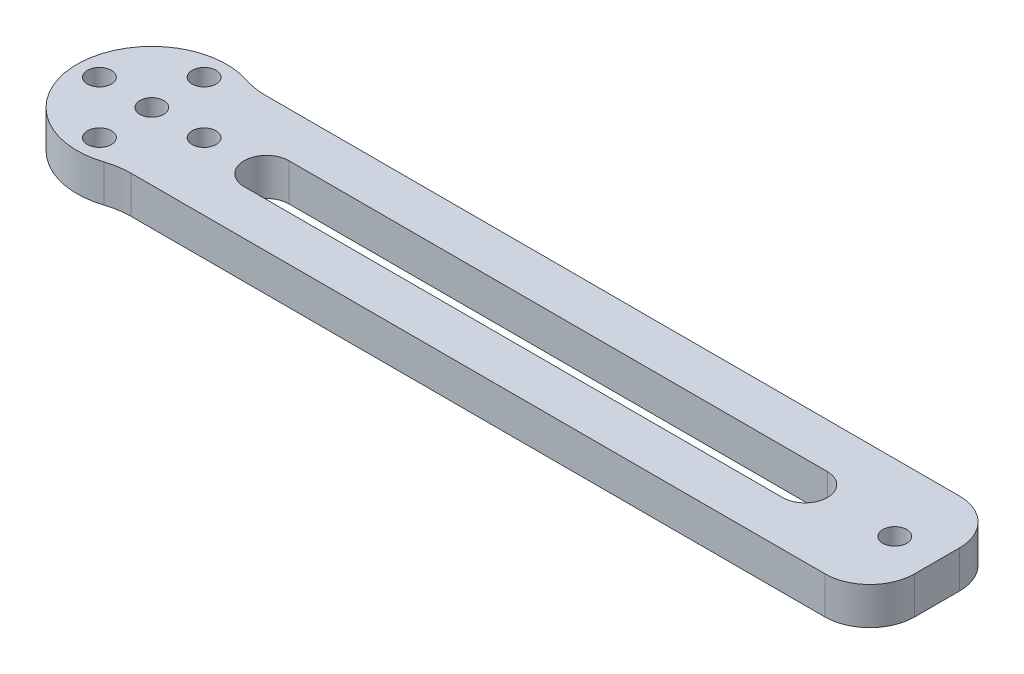
ISO-10303-21;
HEADER;
FILE_DESCRIPTION(('STEP AP214'),'2;1');
FILE_NAME('part.step','',(''),(''),'','','');
FILE_SCHEMA(('AUTOMOTIVE_DESIGN { 1 0 10303 214 1 1 1 1 }'));
ENDSEC;
DATA;
#1=APPLICATION_CONTEXT('core data for automotive mechanical design processes');
#2=APPLICATION_PROTOCOL_DEFINITION('international standard','automotive_design',2000,#1);
#3=PRODUCT_CONTEXT('',#1,'mechanical');
#4=PRODUCT('Part','Part','',(#3));
#5=PRODUCT_RELATED_PRODUCT_CATEGORY('part','',(#4));
#6=PRODUCT_DEFINITION_FORMATION('','',#4);
#7=PRODUCT_DEFINITION_CONTEXT('part definition',#1,'design');
#8=PRODUCT_DEFINITION('design','',#6,#7);
#9=PRODUCT_DEFINITION_SHAPE('','',#8);
#10=(LENGTH_UNIT() NAMED_UNIT(*) SI_UNIT(.MILLI.,.METRE.));
#11=(NAMED_UNIT(*) PLANE_ANGLE_UNIT() SI_UNIT($,.RADIAN.));
#12=(NAMED_UNIT(*) SI_UNIT($,.STERADIAN.) SOLID_ANGLE_UNIT());
#13=UNCERTAINTY_MEASURE_WITH_UNIT(LENGTH_MEASURE(1.E-05),#10,'distance_accuracy_value','');
#14=(GEOMETRIC_REPRESENTATION_CONTEXT(3) GLOBAL_UNCERTAINTY_ASSIGNED_CONTEXT((#13)) GLOBAL_UNIT_ASSIGNED_CONTEXT((#10,
#11,#12)) REPRESENTATION_CONTEXT('',''));
#15=CARTESIAN_POINT('',(0.,0.,0.));
#16=DIRECTION('',(0.,0.,1.));
#17=DIRECTION('',(1.,0.,0.));
#18=AXIS2_PLACEMENT_3D('',#15,#16,#17);
#19=CARTESIAN_POINT('',(99.34,5.,0.));
#20=DIRECTION('',(0.,-1.,0.));
#21=DIRECTION('',(0.,0.,-1.));
#22=AXIS2_PLACEMENT_3D('',#19,#20,#21);
#23=CYLINDRICAL_SURFACE('',#22,1.60000000000001);
#24=CARTESIAN_POINT('',(99.34,5.,0.));
#25=DIRECTION('',(0.,1.,0.));
#26=DIRECTION('',(0.,0.,1.));
#27=AXIS2_PLACEMENT_3D('',#24,#25,#26);
#28=CIRCLE('',#27,1.60000000000001);
#29=CARTESIAN_POINT('',(99.34,5.,1.59999999999999));
#30=VERTEX_POINT('',#29);
#31=EDGE_CURVE('E180',#30,#30,#28,.T.);
#32=ORIENTED_EDGE('',*,*,#31,.T.);
#33=EDGE_LOOP('',(#32));
#34=FACE_BOUND('',#33,.T.);
#35=CARTESIAN_POINT('',(99.34,2.5,0.));
#36=DIRECTION('',(0.,-1.,0.));
#37=DIRECTION('',(0.,0.,-1.));
#38=AXIS2_PLACEMENT_3D('',#35,#36,#37);
#39=CIRCLE('',#38,1.60000000000001);
#40=CARTESIAN_POINT('',(99.34,2.5,-1.60000000000002));
#41=VERTEX_POINT('',#40);
#42=EDGE_CURVE('E201',#41,#41,#39,.T.);
#43=ORIENTED_EDGE('',*,*,#42,.T.);
#44=EDGE_LOOP('',(#43));
#45=FACE_BOUND('',#44,.T.);
#46=ADVANCED_FACE('F47',(#34,#45),#23,.F.);
#47=CARTESIAN_POINT('',(99.,5.,-2.99999999999999));
#48=DIRECTION('',(0.,-1.,0.));
#49=DIRECTION('',(0.,0.,-1.));
#50=AXIS2_PLACEMENT_3D('',#47,#48,#49);
#51=CYLINDRICAL_SURFACE('',#50,6.00000000000001);
#52=CARTESIAN_POINT('',(99.,0.,-2.99999999999999));
#53=DIRECTION('',(0.,1.,0.));
#54=DIRECTION('',(0.,0.,1.));
#55=AXIS2_PLACEMENT_3D('',#52,#53,#54);
#56=CIRCLE('',#55,6.00000000000001);
#57=CARTESIAN_POINT('',(99.,0.,-8.99999999999999));
#58=VERTEX_POINT('',#57);
#59=CARTESIAN_POINT('',(105.,0.,-2.99999999999999));
#60=VERTEX_POINT('',#59);
#61=EDGE_CURVE('E209',#58,#60,#56,.F.);
#62=ORIENTED_EDGE('',*,*,#61,.F.);
#63=DIRECTION('',(0.,-1.,0.));
#64=VECTOR('',#63,1.);
#65=CARTESIAN_POINT('',(99.,5.,-8.99999999999999));
#66=LINE('',#65,#64);
#67=CARTESIAN_POINT('',(99.,5.,-8.99999999999999));
#68=VERTEX_POINT('',#67);
#69=EDGE_CURVE('E242',#68,#58,#66,.T.);
#70=ORIENTED_EDGE('',*,*,#69,.F.);
#71=CARTESIAN_POINT('',(99.,5.,-2.99999999999999));
#72=DIRECTION('',(0.,1.,0.));
#73=DIRECTION('',(0.,0.,1.));
#74=AXIS2_PLACEMENT_3D('',#71,#72,#73);
#75=CIRCLE('',#74,6.00000000000001);
#76=CARTESIAN_POINT('',(105.,5.,-2.99999999999999));
#77=VERTEX_POINT('',#76);
#78=EDGE_CURVE('E166',#68,#77,#75,.F.);
#79=ORIENTED_EDGE('',*,*,#78,.T.);
#80=DIRECTION('',(0.,-1.,0.));
#81=VECTOR('',#80,1.);
#82=CARTESIAN_POINT('',(105.,5.,-2.99999999999999));
#83=LINE('',#82,#81);
#84=EDGE_CURVE('E144',#77,#60,#83,.T.);
#85=ORIENTED_EDGE('',*,*,#84,.T.);
#86=EDGE_LOOP('',(#62,#70,#79,#85));
#87=FACE_BOUND('',#86,.T.);
#88=ADVANCED_FACE('F298',(#87),#51,.T.);
#89=CARTESIAN_POINT('',(0.,5.,-8.99999999999999));
#90=DIRECTION('',(0.,0.,-1.));
#91=DIRECTION('',(-1.,0.,0.));
#92=AXIS2_PLACEMENT_3D('',#89,#90,#91);
#93=PLANE('',#92);
#94=DIRECTION('',(1.,0.,0.));
#95=VECTOR('',#94,1.);
#96=CARTESIAN_POINT('',(0.,0.,-8.99999999999999));
#97=LINE('',#96,#95);
#98=CARTESIAN_POINT('',(6.24499799839843,0.,-8.99999999999999));
#99=VERTEX_POINT('',#98);
#100=EDGE_CURVE('E212',#99,#58,#97,.T.);
#101=ORIENTED_EDGE('',*,*,#100,.F.);
#102=DIRECTION('',(0.,-1.,0.));
#103=VECTOR('',#102,1.);
#104=CARTESIAN_POINT('',(6.24499799839843,5.,-8.99999999999999));
#105=LINE('',#104,#103);
#106=CARTESIAN_POINT('',(6.24499799839843,5.,-8.99999999999999));
#107=VERTEX_POINT('',#106);
#108=EDGE_CURVE('E68',#99,#107,#105,.F.);
#109=ORIENTED_EDGE('',*,*,#108,.T.);
#110=DIRECTION('',(1.,0.,0.));
#111=VECTOR('',#110,1.);
#112=CARTESIAN_POINT('',(0.,5.,-8.99999999999999));
#113=LINE('',#112,#111);
#114=EDGE_CURVE('E169',#107,#68,#113,.T.);
#115=ORIENTED_EDGE('',*,*,#114,.T.);
#116=ORIENTED_EDGE('',*,*,#69,.T.);
#117=EDGE_LOOP('',(#101,#109,#115,#116));
#118=FACE_BOUND('',#117,.T.);
#119=ADVANCED_FACE('F313',(#118),#93,.T.);
#120=CARTESIAN_POINT('',(0.,5.,8.99999999999999));
#121=DIRECTION('',(0.,0.,1.));
#122=DIRECTION('',(1.,0.,0.));
#123=AXIS2_PLACEMENT_3D('',#120,#121,#122);
#124=PLANE('',#123);
#125=DIRECTION('',(-1.,0.,0.));
#126=VECTOR('',#125,1.);
#127=CARTESIAN_POINT('',(0.,5.,8.99999999999999));
#128=LINE('',#127,#126);
#129=CARTESIAN_POINT('',(99.,5.,8.99999999999999));
#130=VERTEX_POINT('',#129);
#131=CARTESIAN_POINT('',(6.24499799839843,5.,8.99999999999999));
#132=VERTEX_POINT('',#131);
#133=EDGE_CURVE('E171',#130,#132,#128,.T.);
#134=ORIENTED_EDGE('',*,*,#133,.T.);
#135=DIRECTION('',(0.,-1.,0.));
#136=VECTOR('',#135,1.);
#137=CARTESIAN_POINT('',(6.24499799839843,0.,8.99999999999999));
#138=LINE('',#137,#136);
#139=CARTESIAN_POINT('',(6.24499799839843,0.,8.99999999999999));
#140=VERTEX_POINT('',#139);
#141=EDGE_CURVE('E258',#132,#140,#138,.T.);
#142=ORIENTED_EDGE('',*,*,#141,.T.);
#143=DIRECTION('',(-1.,0.,0.));
#144=VECTOR('',#143,1.);
#145=CARTESIAN_POINT('',(0.,0.,8.99999999999999));
#146=LINE('',#145,#144);
#147=CARTESIAN_POINT('',(99.,0.,8.99999999999999));
#148=VERTEX_POINT('',#147);
#149=EDGE_CURVE('E214',#148,#140,#146,.T.);
#150=ORIENTED_EDGE('',*,*,#149,.F.);
#151=DIRECTION('',(0.,-1.,0.));
#152=VECTOR('',#151,1.);
#153=CARTESIAN_POINT('',(99.,5.,8.99999999999999));
#154=LINE('',#153,#152);
#155=EDGE_CURVE('E240',#130,#148,#154,.T.);
#156=ORIENTED_EDGE('',*,*,#155,.F.);
#157=EDGE_LOOP('',(#134,#142,#150,#156));
#158=FACE_BOUND('',#157,.T.);
#159=ADVANCED_FACE('F286',(#158),#124,.T.);
#160=CARTESIAN_POINT('',(99.,5.,2.99999999999999));
#161=DIRECTION('',(0.,-1.,0.));
#162=DIRECTION('',(0.,0.,-1.));
#163=AXIS2_PLACEMENT_3D('',#160,#161,#162);
#164=CYLINDRICAL_SURFACE('',#163,6.00000000000001);
#165=CARTESIAN_POINT('',(99.,0.,2.99999999999999));
#166=DIRECTION('',(0.,1.,0.));
#167=DIRECTION('',(0.,0.,1.));
#168=AXIS2_PLACEMENT_3D('',#165,#166,#167);
#169=CIRCLE('',#168,6.00000000000001);
#170=CARTESIAN_POINT('',(105.,0.,2.99999999999999));
#171=VERTEX_POINT('',#170);
#172=EDGE_CURVE('E217',#171,#148,#169,.F.);
#173=ORIENTED_EDGE('',*,*,#172,.F.);
#174=DIRECTION('',(0.,-1.,0.));
#175=VECTOR('',#174,1.);
#176=CARTESIAN_POINT('',(105.,5.,2.99999999999999));
#177=LINE('',#176,#175);
#178=CARTESIAN_POINT('',(105.,5.,2.99999999999999));
#179=VERTEX_POINT('',#178);
#180=EDGE_CURVE('E238',#179,#171,#177,.T.);
#181=ORIENTED_EDGE('',*,*,#180,.F.);
#182=CARTESIAN_POINT('',(99.,5.,2.99999999999999));
#183=DIRECTION('',(0.,1.,0.));
#184=DIRECTION('',(0.,0.,1.));
#185=AXIS2_PLACEMENT_3D('',#182,#183,#184);
#186=CIRCLE('',#185,6.00000000000001);
#187=EDGE_CURVE('E174',#179,#130,#186,.F.);
#188=ORIENTED_EDGE('',*,*,#187,.T.);
#189=ORIENTED_EDGE('',*,*,#155,.T.);
#190=EDGE_LOOP('',(#173,#181,#188,#189));
#191=FACE_BOUND('',#190,.T.);
#192=ADVANCED_FACE('F289',(#191),#164,.T.);
#193=CARTESIAN_POINT('',(87.34,5.,0.));
#194=DIRECTION('',(0.,-1.,0.));
#195=DIRECTION('',(0.,0.,-1.));
#196=AXIS2_PLACEMENT_3D('',#193,#194,#195);
#197=CYLINDRICAL_SURFACE('',#196,3.);
#198=CARTESIAN_POINT('',(87.34,0.,0.));
#199=DIRECTION('',(0.,1.,0.));
#200=DIRECTION('',(0.,0.,1.));
#201=AXIS2_PLACEMENT_3D('',#198,#199,#200);
#202=CIRCLE('',#201,3.);
#203=CARTESIAN_POINT('',(87.34,0.,2.99999999999999));
#204=VERTEX_POINT('',#203);
#205=CARTESIAN_POINT('',(87.34,0.,-3.00000000000001));
#206=VERTEX_POINT('',#205);
#207=EDGE_CURVE('E139',#204,#206,#202,.T.);
#208=ORIENTED_EDGE('',*,*,#207,.F.);
#209=DIRECTION('',(0.,-1.,0.));
#210=VECTOR('',#209,1.);
#211=CARTESIAN_POINT('',(87.34,5.,2.99999999999999));
#212=LINE('',#211,#210);
#213=CARTESIAN_POINT('',(87.34,5.,2.99999999999999));
#214=VERTEX_POINT('',#213);
#215=EDGE_CURVE('E134',#214,#204,#212,.T.);
#216=ORIENTED_EDGE('',*,*,#215,.F.);
#217=CARTESIAN_POINT('',(87.34,5.,0.));
#218=DIRECTION('',(0.,1.,0.));
#219=DIRECTION('',(0.,0.,1.));
#220=AXIS2_PLACEMENT_3D('',#217,#218,#219);
#221=CIRCLE('',#220,3.);
#222=CARTESIAN_POINT('',(87.34,5.,-3.00000000000001));
#223=VERTEX_POINT('',#222);
#224=EDGE_CURVE('E137',#214,#223,#221,.T.);
#225=ORIENTED_EDGE('',*,*,#224,.T.);
#226=DIRECTION('',(0.,-1.,0.));
#227=VECTOR('',#226,1.);
#228=CARTESIAN_POINT('',(87.34,5.,-3.00000000000001));
#229=LINE('',#228,#227);
#230=EDGE_CURVE('E198',#223,#206,#229,.T.);
#231=ORIENTED_EDGE('',*,*,#230,.T.);
#232=EDGE_LOOP('',(#208,#216,#225,#231));
#233=FACE_BOUND('',#232,.T.);
#234=ADVANCED_FACE('F136',(#233),#197,.F.);
#235=CARTESIAN_POINT('',(0.,5.,3.));
#236=DIRECTION('',(0.,0.,-1.));
#237=DIRECTION('',(-1.,0.,0.));
#238=AXIS2_PLACEMENT_3D('',#235,#236,#237);
#239=PLANE('',#238);
#240=DIRECTION('',(1.,0.,0.));
#241=VECTOR('',#240,1.);
#242=CARTESIAN_POINT('',(0.,0.,3.));
#243=LINE('',#242,#241);
#244=CARTESIAN_POINT('',(15.34,0.,3.));
#245=VERTEX_POINT('',#244);
#246=EDGE_CURVE('E200',#245,#204,#243,.T.);
#247=ORIENTED_EDGE('',*,*,#246,.F.);
#248=DIRECTION('',(0.,-1.,0.));
#249=VECTOR('',#248,1.);
#250=CARTESIAN_POINT('',(15.34,5.,3.));
#251=LINE('',#250,#249);
#252=CARTESIAN_POINT('',(15.34,5.,3.));
#253=VERTEX_POINT('',#252);
#254=EDGE_CURVE('E145',#253,#245,#251,.T.);
#255=ORIENTED_EDGE('',*,*,#254,.F.);
#256=DIRECTION('',(1.,0.,0.));
#257=VECTOR('',#256,1.);
#258=CARTESIAN_POINT('',(0.,5.,3.));
#259=LINE('',#258,#257);
#260=EDGE_CURVE('E152',#253,#214,#259,.T.);
#261=ORIENTED_EDGE('',*,*,#260,.T.);
#262=ORIENTED_EDGE('',*,*,#215,.T.);
#263=EDGE_LOOP('',(#247,#255,#261,#262));
#264=FACE_BOUND('',#263,.T.);
#265=ADVANCED_FACE('F159',(#264),#239,.T.);
#266=CARTESIAN_POINT('',(15.34,5.,0.));
#267=DIRECTION('',(0.,-1.,0.));
#268=DIRECTION('',(0.,0.,-1.));
#269=AXIS2_PLACEMENT_3D('',#266,#267,#268);
#270=CYLINDRICAL_SURFACE('',#269,3.);
#271=CARTESIAN_POINT('',(15.34,0.,0.));
#272=DIRECTION('',(0.,1.,0.));
#273=DIRECTION('',(0.,0.,1.));
#274=AXIS2_PLACEMENT_3D('',#271,#272,#273);
#275=CIRCLE('',#274,3.);
#276=CARTESIAN_POINT('',(15.34,0.,-3.));
#277=VERTEX_POINT('',#276);
#278=EDGE_CURVE('E203',#277,#245,#275,.T.);
#279=ORIENTED_EDGE('',*,*,#278,.F.);
#280=DIRECTION('',(0.,-1.,0.));
#281=VECTOR('',#280,1.);
#282=CARTESIAN_POINT('',(15.34,5.,-3.));
#283=LINE('',#282,#281);
#284=CARTESIAN_POINT('',(15.34,5.,-3.));
#285=VERTEX_POINT('',#284);
#286=EDGE_CURVE('E247',#285,#277,#283,.T.);
#287=ORIENTED_EDGE('',*,*,#286,.F.);
#288=CARTESIAN_POINT('',(15.34,5.,0.));
#289=DIRECTION('',(0.,1.,0.));
#290=DIRECTION('',(0.,0.,1.));
#291=AXIS2_PLACEMENT_3D('',#288,#289,#290);
#292=CIRCLE('',#291,3.);
#293=EDGE_CURVE('E160',#285,#253,#292,.T.);
#294=ORIENTED_EDGE('',*,*,#293,.T.);
#295=ORIENTED_EDGE('',*,*,#254,.T.);
#296=EDGE_LOOP('',(#279,#287,#294,#295));
#297=FACE_BOUND('',#296,.T.);
#298=ADVANCED_FACE('F333',(#297),#270,.F.);
#299=CARTESIAN_POINT('',(-7.,5.,0.));
#300=DIRECTION('',(0.,-1.,0.));
#301=DIRECTION('',(0.,0.,-1.));
#302=AXIS2_PLACEMENT_3D('',#299,#300,#301);
#303=CYLINDRICAL_SURFACE('',#302,1.6);
#304=CARTESIAN_POINT('',(-7.,5.,0.));
#305=DIRECTION('',(0.,1.,0.));
#306=DIRECTION('',(0.,0.,1.));
#307=AXIS2_PLACEMENT_3D('',#304,#305,#306);
#308=CIRCLE('',#307,1.6);
#309=CARTESIAN_POINT('',(-7.,5.,1.6));
#310=VERTEX_POINT('',#309);
#311=EDGE_CURVE('E192',#310,#310,#308,.T.);
#312=ORIENTED_EDGE('',*,*,#311,.T.);
#313=EDGE_LOOP('',(#312));
#314=FACE_BOUND('',#313,.T.);
#315=CARTESIAN_POINT('',(-7.,0.,0.));
#316=DIRECTION('',(0.,1.,0.));
#317=DIRECTION('',(0.,0.,1.));
#318=AXIS2_PLACEMENT_3D('',#315,#316,#317);
#319=CIRCLE('',#318,1.6);
#320=CARTESIAN_POINT('',(-7.,0.,1.6));
#321=VERTEX_POINT('',#320);
#322=EDGE_CURVE('E232',#321,#321,#319,.T.);
#323=ORIENTED_EDGE('',*,*,#322,.F.);
#324=EDGE_LOOP('',(#323));
#325=FACE_BOUND('',#324,.T.);
#326=ADVANCED_FACE('F336',(#314,#325),#303,.F.);
#327=CARTESIAN_POINT('',(0.,5.,-7.));
#328=DIRECTION('',(0.,-1.,0.));
#329=DIRECTION('',(0.,0.,-1.));
#330=AXIS2_PLACEMENT_3D('',#327,#328,#329);
#331=CYLINDRICAL_SURFACE('',#330,1.6);
#332=CARTESIAN_POINT('',(0.,5.,-7.));
#333=DIRECTION('',(0.,1.,0.));
#334=DIRECTION('',(0.,0.,1.));
#335=AXIS2_PLACEMENT_3D('',#332,#333,#334);
#336=CIRCLE('',#335,1.6);
#337=CARTESIAN_POINT('',(0.,5.,-5.4));
#338=VERTEX_POINT('',#337);
#339=EDGE_CURVE('E189',#338,#338,#336,.T.);
#340=ORIENTED_EDGE('',*,*,#339,.T.);
#341=EDGE_LOOP('',(#340));
#342=FACE_BOUND('',#341,.T.);
#343=CARTESIAN_POINT('',(0.,0.,-7.));
#344=DIRECTION('',(0.,1.,0.));
#345=DIRECTION('',(0.,0.,1.));
#346=AXIS2_PLACEMENT_3D('',#343,#344,#345);
#347=CIRCLE('',#346,1.6);
#348=CARTESIAN_POINT('',(0.,0.,-5.4));
#349=VERTEX_POINT('',#348);
#350=EDGE_CURVE('E229',#349,#349,#347,.T.);
#351=ORIENTED_EDGE('',*,*,#350,.F.);
#352=EDGE_LOOP('',(#351));
#353=FACE_BOUND('',#352,.T.);
#354=ADVANCED_FACE('F362',(#342,#353),#331,.F.);
#355=CARTESIAN_POINT('',(7.,5.,0.));
#356=DIRECTION('',(0.,-1.,0.));
#357=DIRECTION('',(0.,0.,-1.));
#358=AXIS2_PLACEMENT_3D('',#355,#356,#357);
#359=CYLINDRICAL_SURFACE('',#358,1.6);
#360=CARTESIAN_POINT('',(7.,5.,0.));
#361=DIRECTION('',(0.,1.,0.));
#362=DIRECTION('',(0.,0.,1.));
#363=AXIS2_PLACEMENT_3D('',#360,#361,#362);
#364=CIRCLE('',#363,1.6);
#365=CARTESIAN_POINT('',(7.,5.,1.6));
#366=VERTEX_POINT('',#365);
#367=EDGE_CURVE('E186',#366,#366,#364,.T.);
#368=ORIENTED_EDGE('',*,*,#367,.T.);
#369=EDGE_LOOP('',(#368));
#370=FACE_BOUND('',#369,.T.);
#371=CARTESIAN_POINT('',(7.,0.,0.));
#372=DIRECTION('',(0.,1.,0.));
#373=DIRECTION('',(0.,0.,1.));
#374=AXIS2_PLACEMENT_3D('',#371,#372,#373);
#375=CIRCLE('',#374,1.6);
#376=CARTESIAN_POINT('',(7.,0.,1.6));
#377=VERTEX_POINT('',#376);
#378=EDGE_CURVE('E226',#377,#377,#375,.T.);
#379=ORIENTED_EDGE('',*,*,#378,.F.);
#380=EDGE_LOOP('',(#379));
#381=FACE_BOUND('',#380,.T.);
#382=ADVANCED_FACE('F371',(#370,#381),#359,.F.);
#383=CARTESIAN_POINT('',(0.,5.,7.));
#384=DIRECTION('',(0.,-1.,0.));
#385=DIRECTION('',(0.,0.,-1.));
#386=AXIS2_PLACEMENT_3D('',#383,#384,#385);
#387=CYLINDRICAL_SURFACE('',#386,1.6);
#388=CARTESIAN_POINT('',(0.,5.,7.));
#389=DIRECTION('',(0.,1.,0.));
#390=DIRECTION('',(0.,0.,1.));
#391=AXIS2_PLACEMENT_3D('',#388,#389,#390);
#392=CIRCLE('',#391,1.6);
#393=CARTESIAN_POINT('',(0.,5.,8.6));
#394=VERTEX_POINT('',#393);
#395=EDGE_CURVE('E183',#394,#394,#392,.T.);
#396=ORIENTED_EDGE('',*,*,#395,.T.);
#397=EDGE_LOOP('',(#396));
#398=FACE_BOUND('',#397,.T.);
#399=CARTESIAN_POINT('',(0.,0.,7.));
#400=DIRECTION('',(0.,1.,0.));
#401=DIRECTION('',(0.,0.,1.));
#402=AXIS2_PLACEMENT_3D('',#399,#400,#401);
#403=CIRCLE('',#402,1.6);
#404=CARTESIAN_POINT('',(0.,0.,8.6));
#405=VERTEX_POINT('',#404);
#406=EDGE_CURVE('E223',#405,#405,#403,.T.);
#407=ORIENTED_EDGE('',*,*,#406,.F.);
#408=EDGE_LOOP('',(#407));
#409=FACE_BOUND('',#408,.T.);
#410=ADVANCED_FACE('F318',(#398,#409),#387,.F.);
#411=CARTESIAN_POINT('',(105.,5.,0.));
#412=DIRECTION('',(1.,0.,0.));
#413=DIRECTION('',(0.,0.,-1.));
#414=AXIS2_PLACEMENT_3D('',#411,#412,#413);
#415=PLANE('',#414);
#416=DIRECTION('',(0.,0.,1.));
#417=VECTOR('',#416,1.);
#418=CARTESIAN_POINT('',(105.,0.,0.));
#419=LINE('',#418,#417);
#420=EDGE_CURVE('E220',#60,#171,#419,.T.);
#421=ORIENTED_EDGE('',*,*,#420,.F.);
#422=ORIENTED_EDGE('',*,*,#84,.F.);
#423=DIRECTION('',(0.,0.,1.));
#424=VECTOR('',#423,1.);
#425=CARTESIAN_POINT('',(105.,5.,0.));
#426=LINE('',#425,#424);
#427=EDGE_CURVE('E177',#77,#179,#426,.T.);
#428=ORIENTED_EDGE('',*,*,#427,.T.);
#429=ORIENTED_EDGE('',*,*,#180,.T.);
#430=EDGE_LOOP('',(#421,#422,#428,#429));
#431=FACE_BOUND('',#430,.T.);
#432=ADVANCED_FACE('F294',(#431),#415,.T.);
#433=CARTESIAN_POINT('',(0.,5.,-3.));
#434=DIRECTION('',(0.,0.,-1.));
#435=DIRECTION('',(-1.,0.,0.));
#436=AXIS2_PLACEMENT_3D('',#433,#434,#435);
#437=PLANE('',#436);
#438=DIRECTION('',(1.,0.,0.));
#439=VECTOR('',#438,1.);
#440=CARTESIAN_POINT('',(0.,0.,-3.));
#441=LINE('',#440,#439);
#442=EDGE_CURVE('E206',#277,#206,#441,.T.);
#443=ORIENTED_EDGE('',*,*,#442,.T.);
#444=ORIENTED_EDGE('',*,*,#230,.F.);
#445=DIRECTION('',(1.,0.,0.));
#446=VECTOR('',#445,1.);
#447=CARTESIAN_POINT('',(0.,5.,-3.));
#448=LINE('',#447,#446);
#449=EDGE_CURVE('E155',#285,#223,#448,.T.);
#450=ORIENTED_EDGE('',*,*,#449,.F.);
#451=ORIENTED_EDGE('',*,*,#286,.T.);
#452=EDGE_LOOP('',(#443,#444,#450,#451));
#453=FACE_BOUND('',#452,.T.);
#454=ADVANCED_FACE('F322',(#453),#437,.F.);
#455=CARTESIAN_POINT('',(0.,5.,0.));
#456=DIRECTION('',(0.,-1.,0.));
#457=DIRECTION('',(0.,0.,-1.));
#458=AXIS2_PLACEMENT_3D('',#455,#456,#457);
#459=CYLINDRICAL_SURFACE('',#458,1.6);
#460=CARTESIAN_POINT('',(0.,5.,0.));
#461=DIRECTION('',(0.,1.,0.));
#462=DIRECTION('',(0.,0.,1.));
#463=AXIS2_PLACEMENT_3D('',#460,#461,#462);
#464=CIRCLE('',#463,1.6);
#465=CARTESIAN_POINT('',(0.,5.,1.6));
#466=VERTEX_POINT('',#465);
#467=EDGE_CURVE('E195',#466,#466,#464,.T.);
#468=ORIENTED_EDGE('',*,*,#467,.T.);
#469=EDGE_LOOP('',(#468));
#470=FACE_BOUND('',#469,.T.);
#471=CARTESIAN_POINT('',(0.,0.,0.));
#472=DIRECTION('',(0.,1.,0.));
#473=DIRECTION('',(0.,0.,1.));
#474=AXIS2_PLACEMENT_3D('',#471,#472,#473);
#475=CIRCLE('',#474,1.6);
#476=CARTESIAN_POINT('',(0.,0.,1.6));
#477=VERTEX_POINT('',#476);
#478=EDGE_CURVE('E157',#477,#477,#475,.T.);
#479=ORIENTED_EDGE('',*,*,#478,.F.);
#480=EDGE_LOOP('',(#479));
#481=FACE_BOUND('',#480,.T.);
#482=ADVANCED_FACE('F331',(#470,#481),#459,.F.);
#483=CARTESIAN_POINT('',(0.,5.,0.));
#484=DIRECTION('',(0.,1.,0.));
#485=DIRECTION('',(0.,0.,1.));
#486=AXIS2_PLACEMENT_3D('',#483,#484,#485);
#487=PLANE('',#486);
#488=ORIENTED_EDGE('',*,*,#114,.F.);
#489=CARTESIAN_POINT('',(6.24499799839843,5.,-19.));
#490=DIRECTION('',(0.,1.,0.));
#491=DIRECTION('',(0.,0.,1.));
#492=AXIS2_PLACEMENT_3D('',#489,#490,#491);
#493=CIRCLE('',#492,10.);
#494=CARTESIAN_POINT('',(3.12249899919922,5.,-9.49999999999999));
#495=VERTEX_POINT('',#494);
#496=EDGE_CURVE('E11',#107,#495,#493,.F.);
#497=ORIENTED_EDGE('',*,*,#496,.T.);
#498=CARTESIAN_POINT('',(0.,5.,0.));
#499=DIRECTION('',(0.,1.,0.));
#500=DIRECTION('',(0.,0.,1.));
#501=AXIS2_PLACEMENT_3D('',#498,#499,#500);
#502=CIRCLE('',#501,10.);
#503=CARTESIAN_POINT('',(3.12249899919922,5.,9.49999999999999));
#504=VERTEX_POINT('',#503);
#505=EDGE_CURVE('E279',#495,#504,#502,.T.);
#506=ORIENTED_EDGE('',*,*,#505,.T.);
#507=CARTESIAN_POINT('',(6.24499799839843,5.,19.));
#508=DIRECTION('',(0.,1.,0.));
#509=DIRECTION('',(0.,0.,1.));
#510=AXIS2_PLACEMENT_3D('',#507,#508,#509);
#511=CIRCLE('',#510,10.);
#512=EDGE_CURVE('E261',#504,#132,#511,.F.);
#513=ORIENTED_EDGE('',*,*,#512,.T.);
#514=ORIENTED_EDGE('',*,*,#133,.F.);
#515=ORIENTED_EDGE('',*,*,#187,.F.);
#516=ORIENTED_EDGE('',*,*,#427,.F.);
#517=ORIENTED_EDGE('',*,*,#78,.F.);
#518=EDGE_LOOP('',(#488,#497,#506,#513,#514,#515,#516,#517));
#519=FACE_BOUND('',#518,.T.);
#520=ORIENTED_EDGE('',*,*,#224,.F.);
#521=ORIENTED_EDGE('',*,*,#260,.F.);
#522=ORIENTED_EDGE('',*,*,#293,.F.);
#523=ORIENTED_EDGE('',*,*,#449,.T.);
#524=EDGE_LOOP('',(#520,#521,#522,#523));
#525=FACE_BOUND('',#524,.T.);
#526=ORIENTED_EDGE('',*,*,#31,.F.);
#527=EDGE_LOOP('',(#526));
#528=FACE_BOUND('',#527,.T.);
#529=ORIENTED_EDGE('',*,*,#467,.F.);
#530=EDGE_LOOP('',(#529));
#531=FACE_BOUND('',#530,.T.);
#532=ORIENTED_EDGE('',*,*,#311,.F.);
#533=EDGE_LOOP('',(#532));
#534=FACE_BOUND('',#533,.T.);
#535=ORIENTED_EDGE('',*,*,#339,.F.);
#536=EDGE_LOOP('',(#535));
#537=FACE_BOUND('',#536,.T.);
#538=ORIENTED_EDGE('',*,*,#367,.F.);
#539=EDGE_LOOP('',(#538));
#540=FACE_BOUND('',#539,.T.);
#541=ORIENTED_EDGE('',*,*,#395,.F.);
#542=EDGE_LOOP('',(#541));
#543=FACE_BOUND('',#542,.T.);
#544=ADVANCED_FACE('F149',(#519,#525,#528,#531,#534,#537,#540,#543),#487,.T.);
#545=CARTESIAN_POINT('',(0.,0.,0.));
#546=DIRECTION('',(0.,1.,0.));
#547=DIRECTION('',(0.,0.,1.));
#548=AXIS2_PLACEMENT_3D('',#545,#546,#547);
#549=PLANE('',#548);
#550=CARTESIAN_POINT('',(0.,0.,0.));
#551=DIRECTION('',(0.,1.,0.));
#552=DIRECTION('',(0.,0.,1.));
#553=AXIS2_PLACEMENT_3D('',#550,#551,#552);
#554=CIRCLE('',#553,10.);
#555=CARTESIAN_POINT('',(3.12249899919922,0.,-9.49999999999999));
#556=VERTEX_POINT('',#555);
#557=CARTESIAN_POINT('',(3.12249899919922,0.,9.49999999999999));
#558=VERTEX_POINT('',#557);
#559=EDGE_CURVE('E268',#556,#558,#554,.T.);
#560=ORIENTED_EDGE('',*,*,#559,.F.);
#561=CARTESIAN_POINT('',(6.24499799839843,0.,-19.));
#562=DIRECTION('',(0.,1.,0.));
#563=DIRECTION('',(0.,0.,1.));
#564=AXIS2_PLACEMENT_3D('',#561,#562,#563);
#565=CIRCLE('',#564,10.);
#566=EDGE_CURVE('E55',#556,#99,#565,.T.);
#567=ORIENTED_EDGE('',*,*,#566,.T.);
#568=ORIENTED_EDGE('',*,*,#100,.T.);
#569=ORIENTED_EDGE('',*,*,#61,.T.);
#570=ORIENTED_EDGE('',*,*,#420,.T.);
#571=ORIENTED_EDGE('',*,*,#172,.T.);
#572=ORIENTED_EDGE('',*,*,#149,.T.);
#573=CARTESIAN_POINT('',(6.24499799839843,0.,19.));
#574=DIRECTION('',(0.,1.,0.));
#575=DIRECTION('',(0.,0.,1.));
#576=AXIS2_PLACEMENT_3D('',#573,#574,#575);
#577=CIRCLE('',#576,10.);
#578=EDGE_CURVE('E263',#140,#558,#577,.T.);
#579=ORIENTED_EDGE('',*,*,#578,.T.);
#580=EDGE_LOOP('',(#560,#567,#568,#569,#570,#571,#572,#579));
#581=FACE_BOUND('',#580,.T.);
#582=CARTESIAN_POINT('',(99.34,0.,0.));
#583=DIRECTION('',(0.,-1.,0.));
#584=DIRECTION('',(0.,0.,-1.));
#585=AXIS2_PLACEMENT_3D('',#582,#583,#584);
#586=CIRCLE('',#585,4.19999999999999);
#587=CARTESIAN_POINT('',(99.34,0.,-4.2));
#588=VERTEX_POINT('',#587);
#589=EDGE_CURVE('E278',#588,#588,#586,.T.);
#590=ORIENTED_EDGE('',*,*,#589,.F.);
#591=EDGE_LOOP('',(#590));
#592=FACE_BOUND('',#591,.T.);
#593=ORIENTED_EDGE('',*,*,#207,.T.);
#594=ORIENTED_EDGE('',*,*,#442,.F.);
#595=ORIENTED_EDGE('',*,*,#278,.T.);
#596=ORIENTED_EDGE('',*,*,#246,.T.);
#597=EDGE_LOOP('',(#593,#594,#595,#596));
#598=FACE_BOUND('',#597,.T.);
#599=ORIENTED_EDGE('',*,*,#478,.T.);
#600=EDGE_LOOP('',(#599));
#601=FACE_BOUND('',#600,.T.);
#602=ORIENTED_EDGE('',*,*,#322,.T.);
#603=EDGE_LOOP('',(#602));
#604=FACE_BOUND('',#603,.T.);
#605=ORIENTED_EDGE('',*,*,#350,.T.);
#606=EDGE_LOOP('',(#605));
#607=FACE_BOUND('',#606,.T.);
#608=ORIENTED_EDGE('',*,*,#378,.T.);
#609=EDGE_LOOP('',(#608));
#610=FACE_BOUND('',#609,.T.);
#611=ORIENTED_EDGE('',*,*,#406,.T.);
#612=EDGE_LOOP('',(#611));
#613=FACE_BOUND('',#612,.T.);
#614=ADVANCED_FACE('F266',(#581,#592,#598,#601,#604,#607,#610,#613),#549,.F.);
#615=CARTESIAN_POINT('',(99.34,2.5,0.));
#616=DIRECTION('',(0.,-1.,0.));
#617=DIRECTION('',(0.,0.,-1.));
#618=AXIS2_PLACEMENT_3D('',#615,#616,#617);
#619=CYLINDRICAL_SURFACE('',#618,4.19999999999999);
#620=CARTESIAN_POINT('',(99.34,2.5,0.));
#621=DIRECTION('',(0.,-1.,0.));
#622=DIRECTION('',(0.,0.,-1.));
#623=AXIS2_PLACEMENT_3D('',#620,#621,#622);
#624=CIRCLE('',#623,4.19999999999999);
#625=CARTESIAN_POINT('',(99.34,2.5,-4.2));
#626=VERTEX_POINT('',#625);
#627=EDGE_CURVE('E252',#626,#626,#624,.T.);
#628=ORIENTED_EDGE('',*,*,#627,.F.);
#629=EDGE_LOOP('',(#628));
#630=FACE_BOUND('',#629,.T.);
#631=ORIENTED_EDGE('',*,*,#589,.T.);
#632=EDGE_LOOP('',(#631));
#633=FACE_BOUND('',#632,.T.);
#634=ADVANCED_FACE('F429',(#630,#633),#619,.F.);
#635=CARTESIAN_POINT('',(99.34,2.5,0.));
#636=DIRECTION('',(0.,-1.,0.));
#637=DIRECTION('',(0.,0.,-1.));
#638=AXIS2_PLACEMENT_3D('',#635,#636,#637);
#639=PLANE('',#638);
#640=ORIENTED_EDGE('',*,*,#42,.F.);
#641=EDGE_LOOP('',(#640));
#642=FACE_BOUND('',#641,.T.);
#643=ORIENTED_EDGE('',*,*,#627,.T.);
#644=EDGE_LOOP('',(#643));
#645=FACE_BOUND('',#644,.T.);
#646=ADVANCED_FACE('F445',(#642,#645),#639,.T.);
#647=CARTESIAN_POINT('',(0.,0.,0.));
#648=DIRECTION('',(0.,1.,0.));
#649=DIRECTION('',(0.,0.,1.));
#650=AXIS2_PLACEMENT_3D('',#647,#648,#649);
#651=CYLINDRICAL_SURFACE('',#650,10.);
#652=ORIENTED_EDGE('',*,*,#559,.T.);
#653=DIRECTION('',(0.,1.,0.));
#654=VECTOR('',#653,1.);
#655=CARTESIAN_POINT('',(3.12249899919922,0.,9.49999999999999));
#656=LINE('',#655,#654);
#657=EDGE_CURVE('E255',#558,#504,#656,.T.);
#658=ORIENTED_EDGE('',*,*,#657,.T.);
#659=ORIENTED_EDGE('',*,*,#505,.F.);
#660=DIRECTION('',(0.,1.,0.));
#661=VECTOR('',#660,1.);
#662=CARTESIAN_POINT('',(3.12249899919922,0.,-9.49999999999999));
#663=LINE('',#662,#661);
#664=EDGE_CURVE('E245',#495,#556,#663,.F.);
#665=ORIENTED_EDGE('',*,*,#664,.T.);
#666=EDGE_LOOP('',(#652,#658,#659,#665));
#667=FACE_BOUND('',#666,.T.);
#668=ADVANCED_FACE('F274',(#667),#651,.T.);
#669=CARTESIAN_POINT('',(6.24499799839843,0.,19.));
#670=DIRECTION('',(0.,1.,0.));
#671=DIRECTION('',(0.,0.,1.));
#672=AXIS2_PLACEMENT_3D('',#669,#670,#671);
#673=CYLINDRICAL_SURFACE('',#672,10.);
#674=ORIENTED_EDGE('',*,*,#578,.F.);
#675=ORIENTED_EDGE('',*,*,#141,.F.);
#676=ORIENTED_EDGE('',*,*,#512,.F.);
#677=ORIENTED_EDGE('',*,*,#657,.F.);
#678=EDGE_LOOP('',(#674,#675,#676,#677));
#679=FACE_BOUND('',#678,.T.);
#680=ADVANCED_FACE('F281',(#679),#673,.F.);
#681=CARTESIAN_POINT('',(6.24499799839843,0.,-19.));
#682=DIRECTION('',(0.,1.,0.));
#683=DIRECTION('',(0.,0.,1.));
#684=AXIS2_PLACEMENT_3D('',#681,#682,#683);
#685=CYLINDRICAL_SURFACE('',#684,10.);
#686=ORIENTED_EDGE('',*,*,#496,.F.);
#687=ORIENTED_EDGE('',*,*,#108,.F.);
#688=ORIENTED_EDGE('',*,*,#566,.F.);
#689=ORIENTED_EDGE('',*,*,#664,.F.);
#690=EDGE_LOOP('',(#686,#687,#688,#689));
#691=FACE_BOUND('',#690,.T.);
#692=ADVANCED_FACE('F49',(#691),#685,.F.);
#693=CLOSED_SHELL('',(#46,#88,#119,#159,#192,#234,#265,#298,#326,#354,#382,#410,#432,#454,#482,
#544,#614,#634,#646,#668,#680,#692));
#694=MANIFOLD_SOLID_BREP('B2',#693);
#695=ADVANCED_BREP_SHAPE_REPRESENTATION('',(#18,#694),#14);
#696=SHAPE_DEFINITION_REPRESENTATION(#9,#695);
ENDSEC;
END-ISO-10303-21;
